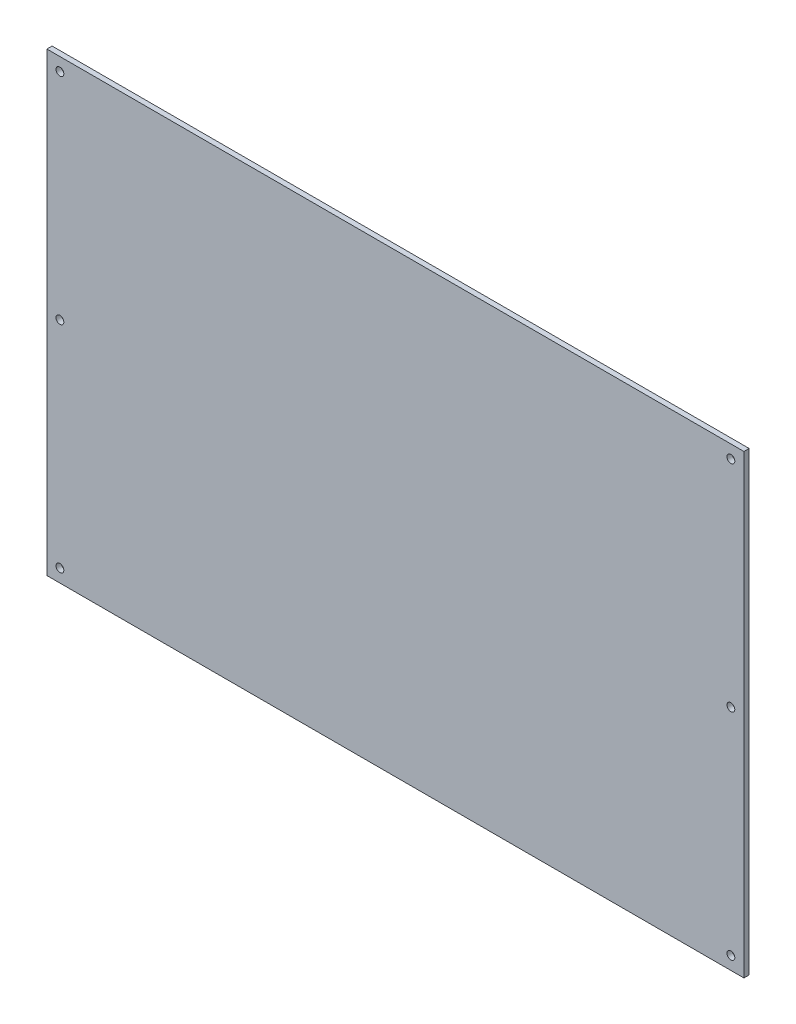
ISO-10303-21;
HEADER;
FILE_DESCRIPTION(('STEP AP214'),'2;1');
FILE_NAME('part.step','',(''),(''),'','','');
FILE_SCHEMA(('AUTOMOTIVE_DESIGN { 1 0 10303 214 1 1 1 1 }'));
ENDSEC;
DATA;
#1=APPLICATION_CONTEXT('core data for automotive mechanical design processes');
#2=APPLICATION_PROTOCOL_DEFINITION('international standard','automotive_design',2000,#1);
#3=PRODUCT_CONTEXT('',#1,'mechanical');
#4=PRODUCT('Part','Part','',(#3));
#5=PRODUCT_RELATED_PRODUCT_CATEGORY('part','',(#4));
#6=PRODUCT_DEFINITION_FORMATION('','',#4);
#7=PRODUCT_DEFINITION_CONTEXT('part definition',#1,'design');
#8=PRODUCT_DEFINITION('design','',#6,#7);
#9=PRODUCT_DEFINITION_SHAPE('','',#8);
#10=(LENGTH_UNIT() NAMED_UNIT(*) SI_UNIT(.MILLI.,.METRE.));
#11=(NAMED_UNIT(*) PLANE_ANGLE_UNIT() SI_UNIT($,.RADIAN.));
#12=(NAMED_UNIT(*) SI_UNIT($,.STERADIAN.) SOLID_ANGLE_UNIT());
#13=UNCERTAINTY_MEASURE_WITH_UNIT(LENGTH_MEASURE(1.E-05),#10,'distance_accuracy_value','');
#14=(GEOMETRIC_REPRESENTATION_CONTEXT(3) GLOBAL_UNCERTAINTY_ASSIGNED_CONTEXT((#13)) GLOBAL_UNIT_ASSIGNED_CONTEXT((#10,
#11,#12)) REPRESENTATION_CONTEXT('',''));
#15=CARTESIAN_POINT('',(0.,0.,0.));
#16=DIRECTION('',(0.,0.,1.));
#17=DIRECTION('',(1.,0.,0.));
#18=AXIS2_PLACEMENT_3D('',#15,#16,#17);
#19=CARTESIAN_POINT('',(0.,0.,4.));
#20=DIRECTION('',(0.,0.,1.));
#21=DIRECTION('',(1.,0.,0.));
#22=AXIS2_PLACEMENT_3D('',#19,#20,#21);
#23=PLANE('',#22);
#24=CARTESIAN_POINT('',(257.5,0.,4.));
#25=DIRECTION('',(0.,0.,1.));
#26=DIRECTION('',(1.,0.,0.));
#27=AXIS2_PLACEMENT_3D('',#24,#25,#26);
#28=CIRCLE('',#27,2.99999999999999);
#29=CARTESIAN_POINT('',(260.5,0.,4.));
#30=VERTEX_POINT('',#29);
#31=EDGE_CURVE('E133',#30,#30,#28,.T.);
#32=ORIENTED_EDGE('',*,*,#31,.F.);
#33=EDGE_LOOP('',(#32));
#34=FACE_BOUND('',#33,.T.);
#35=CARTESIAN_POINT('',(-257.5,-165.,4.));
#36=DIRECTION('',(0.,0.,1.));
#37=DIRECTION('',(1.,0.,0.));
#38=AXIS2_PLACEMENT_3D('',#35,#36,#37);
#39=CIRCLE('',#38,2.99999999999999);
#40=CARTESIAN_POINT('',(-254.5,-165.,4.));
#41=VERTEX_POINT('',#40);
#42=EDGE_CURVE('E121',#41,#41,#39,.T.);
#43=ORIENTED_EDGE('',*,*,#42,.F.);
#44=EDGE_LOOP('',(#43));
#45=FACE_BOUND('',#44,.T.);
#46=CARTESIAN_POINT('',(-257.5,165.,4.));
#47=DIRECTION('',(0.,0.,1.));
#48=DIRECTION('',(1.,0.,0.));
#49=AXIS2_PLACEMENT_3D('',#46,#47,#48);
#50=CIRCLE('',#49,2.99999999999999);
#51=CARTESIAN_POINT('',(-254.5,165.,4.));
#52=VERTEX_POINT('',#51);
#53=EDGE_CURVE('E100',#52,#52,#50,.T.);
#54=ORIENTED_EDGE('',*,*,#53,.F.);
#55=EDGE_LOOP('',(#54));
#56=FACE_BOUND('',#55,.T.);
#57=DIRECTION('',(0.,-1.,0.));
#58=VECTOR('',#57,1.);
#59=CARTESIAN_POINT('',(-267.5,-175.,4.));
#60=LINE('',#59,#58);
#61=CARTESIAN_POINT('',(-267.5,175.,4.));
#62=VERTEX_POINT('',#61);
#63=CARTESIAN_POINT('',(-267.5,-175.,4.));
#64=VERTEX_POINT('',#63);
#65=EDGE_CURVE('E85',#62,#64,#60,.T.);
#66=ORIENTED_EDGE('',*,*,#65,.T.);
#67=DIRECTION('',(1.,0.,0.));
#68=VECTOR('',#67,1.);
#69=CARTESIAN_POINT('',(267.5,-175.,4.));
#70=LINE('',#69,#68);
#71=CARTESIAN_POINT('',(267.5,-175.,4.));
#72=VERTEX_POINT('',#71);
#73=EDGE_CURVE('E80',#64,#72,#70,.T.);
#74=ORIENTED_EDGE('',*,*,#73,.T.);
#75=DIRECTION('',(0.,1.,0.));
#76=VECTOR('',#75,1.);
#77=CARTESIAN_POINT('',(267.5,-175.,4.));
#78=LINE('',#77,#76);
#79=CARTESIAN_POINT('',(267.5,175.,4.));
#80=VERTEX_POINT('',#79);
#81=EDGE_CURVE('E83',#72,#80,#78,.T.);
#82=ORIENTED_EDGE('',*,*,#81,.T.);
#83=DIRECTION('',(-1.,0.,0.));
#84=VECTOR('',#83,1.);
#85=CARTESIAN_POINT('',(267.5,175.,4.));
#86=LINE('',#85,#84);
#87=EDGE_CURVE('E50',#80,#62,#86,.T.);
#88=ORIENTED_EDGE('',*,*,#87,.T.);
#89=EDGE_LOOP('',(#66,#74,#82,#88));
#90=FACE_BOUND('',#89,.T.);
#91=CARTESIAN_POINT('',(-257.5,0.,4.));
#92=DIRECTION('',(0.,0.,1.));
#93=DIRECTION('',(1.,0.,0.));
#94=AXIS2_PLACEMENT_3D('',#91,#92,#93);
#95=CIRCLE('',#94,2.99999999999999);
#96=CARTESIAN_POINT('',(-254.5,0.,4.));
#97=VERTEX_POINT('',#96);
#98=EDGE_CURVE('E115',#97,#97,#95,.T.);
#99=ORIENTED_EDGE('',*,*,#98,.F.);
#100=EDGE_LOOP('',(#99));
#101=FACE_BOUND('',#100,.T.);
#102=CARTESIAN_POINT('',(257.5,165.,4.));
#103=DIRECTION('',(0.,0.,1.));
#104=DIRECTION('',(1.,0.,0.));
#105=AXIS2_PLACEMENT_3D('',#102,#103,#104);
#106=CIRCLE('',#105,2.99999999999999);
#107=CARTESIAN_POINT('',(260.5,165.,4.));
#108=VERTEX_POINT('',#107);
#109=EDGE_CURVE('E127',#108,#108,#106,.T.);
#110=ORIENTED_EDGE('',*,*,#109,.F.);
#111=EDGE_LOOP('',(#110));
#112=FACE_BOUND('',#111,.T.);
#113=CARTESIAN_POINT('',(257.5,-165.,4.));
#114=DIRECTION('',(0.,0.,1.));
#115=DIRECTION('',(1.,0.,0.));
#116=AXIS2_PLACEMENT_3D('',#113,#114,#115);
#117=CIRCLE('',#116,2.99999999999999);
#118=CARTESIAN_POINT('',(260.5,-165.,4.));
#119=VERTEX_POINT('',#118);
#120=EDGE_CURVE('E139',#119,#119,#117,.T.);
#121=ORIENTED_EDGE('',*,*,#120,.F.);
#122=EDGE_LOOP('',(#121));
#123=FACE_BOUND('',#122,.T.);
#124=ADVANCED_FACE('F33',(#34,#45,#56,#90,#101,#112,#123),#23,.T.);
#125=CARTESIAN_POINT('',(0.,0.,0.));
#126=DIRECTION('',(0.,0.,1.));
#127=DIRECTION('',(1.,0.,0.));
#128=AXIS2_PLACEMENT_3D('',#125,#126,#127);
#129=PLANE('',#128);
#130=DIRECTION('',(0.,-1.,0.));
#131=VECTOR('',#130,1.);
#132=CARTESIAN_POINT('',(-267.5,-175.,0.));
#133=LINE('',#132,#131);
#134=CARTESIAN_POINT('',(-267.5,175.,0.));
#135=VERTEX_POINT('',#134);
#136=CARTESIAN_POINT('',(-267.5,-175.,0.));
#137=VERTEX_POINT('',#136);
#138=EDGE_CURVE('E97',#135,#137,#133,.T.);
#139=ORIENTED_EDGE('',*,*,#138,.F.);
#140=DIRECTION('',(-1.,0.,0.));
#141=VECTOR('',#140,1.);
#142=CARTESIAN_POINT('',(267.5,175.,0.));
#143=LINE('',#142,#141);
#144=CARTESIAN_POINT('',(267.5,175.,0.));
#145=VERTEX_POINT('',#144);
#146=EDGE_CURVE('E73',#145,#135,#143,.T.);
#147=ORIENTED_EDGE('',*,*,#146,.F.);
#148=DIRECTION('',(0.,1.,0.));
#149=VECTOR('',#148,1.);
#150=CARTESIAN_POINT('',(267.5,-175.,0.));
#151=LINE('',#150,#149);
#152=CARTESIAN_POINT('',(267.5,-175.,0.));
#153=VERTEX_POINT('',#152);
#154=EDGE_CURVE('E67',#153,#145,#151,.T.);
#155=ORIENTED_EDGE('',*,*,#154,.F.);
#156=DIRECTION('',(1.,0.,0.));
#157=VECTOR('',#156,1.);
#158=CARTESIAN_POINT('',(267.5,-175.,0.));
#159=LINE('',#158,#157);
#160=EDGE_CURVE('E89',#137,#153,#159,.T.);
#161=ORIENTED_EDGE('',*,*,#160,.F.);
#162=EDGE_LOOP('',(#139,#147,#155,#161));
#163=FACE_BOUND('',#162,.T.);
#164=CARTESIAN_POINT('',(-257.5,165.,0.));
#165=DIRECTION('',(0.,0.,1.));
#166=DIRECTION('',(1.,0.,0.));
#167=AXIS2_PLACEMENT_3D('',#164,#165,#166);
#168=CIRCLE('',#167,2.99999999999999);
#169=CARTESIAN_POINT('',(-254.5,165.,0.));
#170=VERTEX_POINT('',#169);
#171=EDGE_CURVE('E112',#170,#170,#168,.T.);
#172=ORIENTED_EDGE('',*,*,#171,.T.);
#173=EDGE_LOOP('',(#172));
#174=FACE_BOUND('',#173,.T.);
#175=CARTESIAN_POINT('',(-257.5,0.,0.));
#176=DIRECTION('',(0.,0.,1.));
#177=DIRECTION('',(1.,0.,0.));
#178=AXIS2_PLACEMENT_3D('',#175,#176,#177);
#179=CIRCLE('',#178,2.99999999999999);
#180=CARTESIAN_POINT('',(-254.5,0.,0.));
#181=VERTEX_POINT('',#180);
#182=EDGE_CURVE('E118',#181,#181,#179,.T.);
#183=ORIENTED_EDGE('',*,*,#182,.T.);
#184=EDGE_LOOP('',(#183));
#185=FACE_BOUND('',#184,.T.);
#186=CARTESIAN_POINT('',(-257.5,-165.,0.));
#187=DIRECTION('',(0.,0.,1.));
#188=DIRECTION('',(1.,0.,0.));
#189=AXIS2_PLACEMENT_3D('',#186,#187,#188);
#190=CIRCLE('',#189,2.99999999999999);
#191=CARTESIAN_POINT('',(-254.5,-165.,0.));
#192=VERTEX_POINT('',#191);
#193=EDGE_CURVE('E124',#192,#192,#190,.T.);
#194=ORIENTED_EDGE('',*,*,#193,.T.);
#195=EDGE_LOOP('',(#194));
#196=FACE_BOUND('',#195,.T.);
#197=CARTESIAN_POINT('',(257.5,165.,0.));
#198=DIRECTION('',(0.,0.,1.));
#199=DIRECTION('',(1.,0.,0.));
#200=AXIS2_PLACEMENT_3D('',#197,#198,#199);
#201=CIRCLE('',#200,2.99999999999999);
#202=CARTESIAN_POINT('',(260.5,165.,0.));
#203=VERTEX_POINT('',#202);
#204=EDGE_CURVE('E130',#203,#203,#201,.T.);
#205=ORIENTED_EDGE('',*,*,#204,.T.);
#206=EDGE_LOOP('',(#205));
#207=FACE_BOUND('',#206,.T.);
#208=CARTESIAN_POINT('',(257.5,0.,0.));
#209=DIRECTION('',(0.,0.,1.));
#210=DIRECTION('',(1.,0.,0.));
#211=AXIS2_PLACEMENT_3D('',#208,#209,#210);
#212=CIRCLE('',#211,2.99999999999999);
#213=CARTESIAN_POINT('',(260.5,0.,0.));
#214=VERTEX_POINT('',#213);
#215=EDGE_CURVE('E136',#214,#214,#212,.T.);
#216=ORIENTED_EDGE('',*,*,#215,.T.);
#217=EDGE_LOOP('',(#216));
#218=FACE_BOUND('',#217,.T.);
#219=CARTESIAN_POINT('',(257.5,-165.,0.));
#220=DIRECTION('',(0.,0.,1.));
#221=DIRECTION('',(1.,0.,0.));
#222=AXIS2_PLACEMENT_3D('',#219,#220,#221);
#223=CIRCLE('',#222,2.99999999999999);
#224=CARTESIAN_POINT('',(260.5,-165.,0.));
#225=VERTEX_POINT('',#224);
#226=EDGE_CURVE('E142',#225,#225,#223,.T.);
#227=ORIENTED_EDGE('',*,*,#226,.T.);
#228=EDGE_LOOP('',(#227));
#229=FACE_BOUND('',#228,.T.);
#230=ADVANCED_FACE('F108',(#163,#174,#185,#196,#207,#218,#229),#129,.F.);
#231=CARTESIAN_POINT('',(-267.5,-175.,4.));
#232=DIRECTION('',(1.,0.,0.));
#233=DIRECTION('',(0.,1.,0.));
#234=AXIS2_PLACEMENT_3D('',#231,#232,#233);
#235=PLANE('',#234);
#236=ORIENTED_EDGE('',*,*,#138,.T.);
#237=DIRECTION('',(0.,0.,-1.));
#238=VECTOR('',#237,1.);
#239=CARTESIAN_POINT('',(-267.5,-175.,4.));
#240=LINE('',#239,#238);
#241=EDGE_CURVE('E11',#64,#137,#240,.T.);
#242=ORIENTED_EDGE('',*,*,#241,.F.);
#243=ORIENTED_EDGE('',*,*,#65,.F.);
#244=DIRECTION('',(0.,0.,-1.));
#245=VECTOR('',#244,1.);
#246=CARTESIAN_POINT('',(-267.5,175.,4.));
#247=LINE('',#246,#245);
#248=EDGE_CURVE('E93',#62,#135,#247,.T.);
#249=ORIENTED_EDGE('',*,*,#248,.T.);
#250=EDGE_LOOP('',(#236,#242,#243,#249));
#251=FACE_BOUND('',#250,.T.);
#252=ADVANCED_FACE('F35',(#251),#235,.F.);
#253=CARTESIAN_POINT('',(267.5,-175.,4.));
#254=DIRECTION('',(0.,1.,0.));
#255=DIRECTION('',(-1.,0.,0.));
#256=AXIS2_PLACEMENT_3D('',#253,#254,#255);
#257=PLANE('',#256);
#258=ORIENTED_EDGE('',*,*,#160,.T.);
#259=DIRECTION('',(0.,0.,-1.));
#260=VECTOR('',#259,1.);
#261=CARTESIAN_POINT('',(267.5,-175.,4.));
#262=LINE('',#261,#260);
#263=EDGE_CURVE('E42',#72,#153,#262,.T.);
#264=ORIENTED_EDGE('',*,*,#263,.F.);
#265=ORIENTED_EDGE('',*,*,#73,.F.);
#266=ORIENTED_EDGE('',*,*,#241,.T.);
#267=EDGE_LOOP('',(#258,#264,#265,#266));
#268=FACE_BOUND('',#267,.T.);
#269=ADVANCED_FACE('F88',(#268),#257,.F.);
#270=CARTESIAN_POINT('',(267.5,-175.,4.));
#271=DIRECTION('',(-1.,0.,0.));
#272=DIRECTION('',(0.,-1.,0.));
#273=AXIS2_PLACEMENT_3D('',#270,#271,#272);
#274=PLANE('',#273);
#275=ORIENTED_EDGE('',*,*,#154,.T.);
#276=DIRECTION('',(0.,0.,-1.));
#277=VECTOR('',#276,1.);
#278=CARTESIAN_POINT('',(267.5,175.,4.));
#279=LINE('',#278,#277);
#280=EDGE_CURVE('E90',#80,#145,#279,.T.);
#281=ORIENTED_EDGE('',*,*,#280,.F.);
#282=ORIENTED_EDGE('',*,*,#81,.F.);
#283=ORIENTED_EDGE('',*,*,#263,.T.);
#284=EDGE_LOOP('',(#275,#281,#282,#283));
#285=FACE_BOUND('',#284,.T.);
#286=ADVANCED_FACE('F91',(#285),#274,.F.);
#287=CARTESIAN_POINT('',(267.5,175.,4.));
#288=DIRECTION('',(0.,-1.,0.));
#289=DIRECTION('',(1.,0.,0.));
#290=AXIS2_PLACEMENT_3D('',#287,#288,#289);
#291=PLANE('',#290);
#292=ORIENTED_EDGE('',*,*,#146,.T.);
#293=ORIENTED_EDGE('',*,*,#248,.F.);
#294=ORIENTED_EDGE('',*,*,#87,.F.);
#295=ORIENTED_EDGE('',*,*,#280,.T.);
#296=EDGE_LOOP('',(#292,#293,#294,#295));
#297=FACE_BOUND('',#296,.T.);
#298=ADVANCED_FACE('F105',(#297),#291,.F.);
#299=CARTESIAN_POINT('',(-257.5,165.,4.));
#300=DIRECTION('',(0.,0.,-1.));
#301=DIRECTION('',(-1.,0.,0.));
#302=AXIS2_PLACEMENT_3D('',#299,#300,#301);
#303=CYLINDRICAL_SURFACE('',#302,2.99999999999999);
#304=ORIENTED_EDGE('',*,*,#53,.T.);
#305=EDGE_LOOP('',(#304));
#306=FACE_BOUND('',#305,.T.);
#307=ORIENTED_EDGE('',*,*,#171,.F.);
#308=EDGE_LOOP('',(#307));
#309=FACE_BOUND('',#308,.T.);
#310=ADVANCED_FACE('F161',(#306,#309),#303,.F.);
#311=CARTESIAN_POINT('',(-257.5,0.,4.));
#312=DIRECTION('',(0.,0.,-1.));
#313=DIRECTION('',(-1.,0.,0.));
#314=AXIS2_PLACEMENT_3D('',#311,#312,#313);
#315=CYLINDRICAL_SURFACE('',#314,2.99999999999999);
#316=ORIENTED_EDGE('',*,*,#98,.T.);
#317=EDGE_LOOP('',(#316));
#318=FACE_BOUND('',#317,.T.);
#319=ORIENTED_EDGE('',*,*,#182,.F.);
#320=EDGE_LOOP('',(#319));
#321=FACE_BOUND('',#320,.T.);
#322=ADVANCED_FACE('F207',(#318,#321),#315,.F.);
#323=CARTESIAN_POINT('',(-257.5,-165.,4.));
#324=DIRECTION('',(0.,0.,-1.));
#325=DIRECTION('',(-1.,0.,0.));
#326=AXIS2_PLACEMENT_3D('',#323,#324,#325);
#327=CYLINDRICAL_SURFACE('',#326,2.99999999999999);
#328=ORIENTED_EDGE('',*,*,#42,.T.);
#329=EDGE_LOOP('',(#328));
#330=FACE_BOUND('',#329,.T.);
#331=ORIENTED_EDGE('',*,*,#193,.F.);
#332=EDGE_LOOP('',(#331));
#333=FACE_BOUND('',#332,.T.);
#334=ADVANCED_FACE('F215',(#330,#333),#327,.F.);
#335=CARTESIAN_POINT('',(257.5,165.,4.));
#336=DIRECTION('',(0.,0.,-1.));
#337=DIRECTION('',(-1.,0.,0.));
#338=AXIS2_PLACEMENT_3D('',#335,#336,#337);
#339=CYLINDRICAL_SURFACE('',#338,2.99999999999999);
#340=ORIENTED_EDGE('',*,*,#109,.T.);
#341=EDGE_LOOP('',(#340));
#342=FACE_BOUND('',#341,.T.);
#343=ORIENTED_EDGE('',*,*,#204,.F.);
#344=EDGE_LOOP('',(#343));
#345=FACE_BOUND('',#344,.T.);
#346=ADVANCED_FACE('F223',(#342,#345),#339,.F.);
#347=CARTESIAN_POINT('',(257.5,0.,4.));
#348=DIRECTION('',(0.,0.,-1.));
#349=DIRECTION('',(-1.,0.,0.));
#350=AXIS2_PLACEMENT_3D('',#347,#348,#349);
#351=CYLINDRICAL_SURFACE('',#350,2.99999999999999);
#352=ORIENTED_EDGE('',*,*,#31,.T.);
#353=EDGE_LOOP('',(#352));
#354=FACE_BOUND('',#353,.T.);
#355=ORIENTED_EDGE('',*,*,#215,.F.);
#356=EDGE_LOOP('',(#355));
#357=FACE_BOUND('',#356,.T.);
#358=ADVANCED_FACE('F232',(#354,#357),#351,.F.);
#359=CARTESIAN_POINT('',(257.5,-165.,4.));
#360=DIRECTION('',(0.,0.,-1.));
#361=DIRECTION('',(-1.,0.,0.));
#362=AXIS2_PLACEMENT_3D('',#359,#360,#361);
#363=CYLINDRICAL_SURFACE('',#362,2.99999999999999);
#364=ORIENTED_EDGE('',*,*,#120,.T.);
#365=EDGE_LOOP('',(#364));
#366=FACE_BOUND('',#365,.T.);
#367=ORIENTED_EDGE('',*,*,#226,.F.);
#368=EDGE_LOOP('',(#367));
#369=FACE_BOUND('',#368,.T.);
#370=ADVANCED_FACE('F148',(#366,#369),#363,.F.);
#371=CLOSED_SHELL('',(#124,#230,#252,#269,#286,#298,#310,#322,#334,#346,#358,#370));
#372=MANIFOLD_SOLID_BREP('B2',#371);
#373=ADVANCED_BREP_SHAPE_REPRESENTATION('',(#18,#372),#14);
#374=SHAPE_DEFINITION_REPRESENTATION(#9,#373);
ENDSEC;
END-ISO-10303-21;
